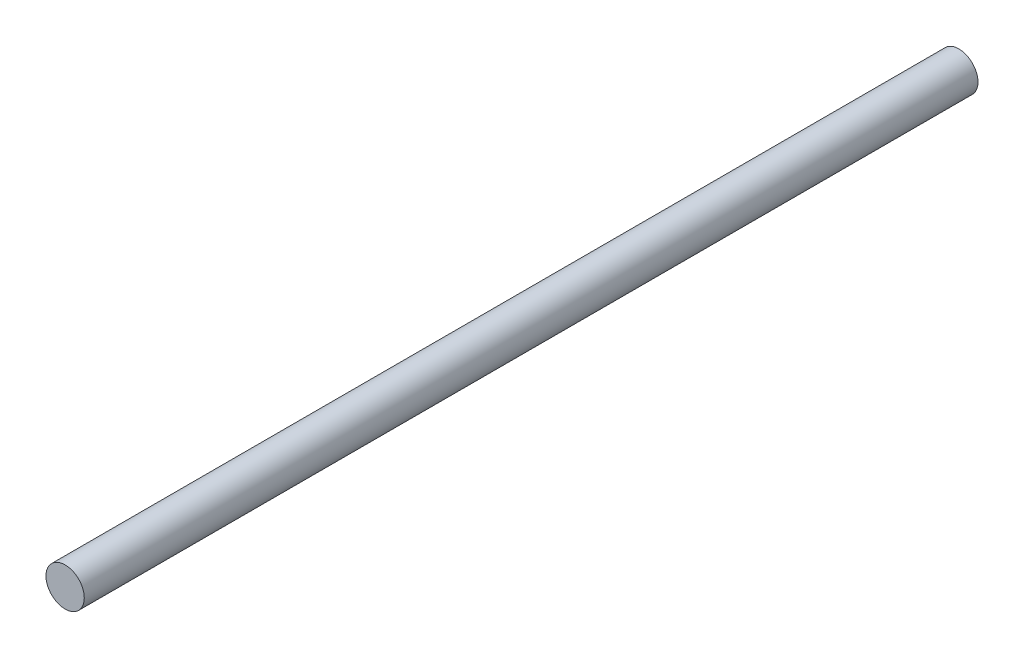
ISO-10303-21;
HEADER;
FILE_DESCRIPTION(('STEP AP214'),'2;1');
FILE_NAME('part.step','',(''),(''),'','','');
FILE_SCHEMA(('AUTOMOTIVE_DESIGN { 1 0 10303 214 1 1 1 1 }'));
ENDSEC;
DATA;
#1=APPLICATION_CONTEXT('core data for automotive mechanical design processes');
#2=APPLICATION_PROTOCOL_DEFINITION('international standard','automotive_design',2000,#1);
#3=PRODUCT_CONTEXT('',#1,'mechanical');
#4=PRODUCT('Part','Part','',(#3));
#5=PRODUCT_RELATED_PRODUCT_CATEGORY('part','',(#4));
#6=PRODUCT_DEFINITION_FORMATION('','',#4);
#7=PRODUCT_DEFINITION_CONTEXT('part definition',#1,'design');
#8=PRODUCT_DEFINITION('design','',#6,#7);
#9=PRODUCT_DEFINITION_SHAPE('','',#8);
#10=(LENGTH_UNIT() NAMED_UNIT(*) SI_UNIT(.MILLI.,.METRE.));
#11=(NAMED_UNIT(*) PLANE_ANGLE_UNIT() SI_UNIT($,.RADIAN.));
#12=(NAMED_UNIT(*) SI_UNIT($,.STERADIAN.) SOLID_ANGLE_UNIT());
#13=UNCERTAINTY_MEASURE_WITH_UNIT(LENGTH_MEASURE(1.E-05),#10,'distance_accuracy_value','');
#14=(GEOMETRIC_REPRESENTATION_CONTEXT(3) GLOBAL_UNCERTAINTY_ASSIGNED_CONTEXT((#13)) GLOBAL_UNIT_ASSIGNED_CONTEXT((#10,
#11,#12)) REPRESENTATION_CONTEXT('',''));
#15=CARTESIAN_POINT('',(0.,0.,0.));
#16=DIRECTION('',(0.,0.,1.));
#17=DIRECTION('',(1.,0.,0.));
#18=AXIS2_PLACEMENT_3D('',#15,#16,#17);
#19=CARTESIAN_POINT('',(0.,0.,177.8));
#20=DIRECTION('',(0.,0.,-1.));
#21=DIRECTION('',(-1.,0.,0.));
#22=AXIS2_PLACEMENT_3D('',#19,#20,#21);
#23=CYLINDRICAL_SURFACE('',#22,3.81);
#24=CARTESIAN_POINT('',(0.,0.,177.8));
#25=DIRECTION('',(0.,0.,1.));
#26=DIRECTION('',(1.,0.,0.));
#27=AXIS2_PLACEMENT_3D('',#24,#25,#26);
#28=CIRCLE('',#27,3.81);
#29=CARTESIAN_POINT('',(3.81,0.,177.8));
#30=VERTEX_POINT('',#29);
#31=EDGE_CURVE('E10',#30,#30,#28,.T.);
#32=ORIENTED_EDGE('',*,*,#31,.F.);
#33=EDGE_LOOP('',(#32));
#34=FACE_BOUND('',#33,.T.);
#35=CARTESIAN_POINT('',(0.,0.,0.));
#36=DIRECTION('',(0.,0.,1.));
#37=DIRECTION('',(1.,0.,0.));
#38=AXIS2_PLACEMENT_3D('',#35,#36,#37);
#39=CIRCLE('',#38,3.81);
#40=CARTESIAN_POINT('',(3.81,0.,0.));
#41=VERTEX_POINT('',#40);
#42=EDGE_CURVE('E35',#41,#41,#39,.T.);
#43=ORIENTED_EDGE('',*,*,#42,.T.);
#44=EDGE_LOOP('',(#43));
#45=FACE_BOUND('',#44,.T.);
#46=ADVANCED_FACE('F32',(#34,#45),#23,.T.);
#47=CARTESIAN_POINT('',(0.,0.,177.8));
#48=DIRECTION('',(0.,0.,1.));
#49=DIRECTION('',(1.,0.,0.));
#50=AXIS2_PLACEMENT_3D('',#47,#48,#49);
#51=PLANE('',#50);
#52=ORIENTED_EDGE('',*,*,#31,.T.);
#53=EDGE_LOOP('',(#52));
#54=FACE_BOUND('',#53,.T.);
#55=ADVANCED_FACE('F47',(#54),#51,.T.);
#56=CARTESIAN_POINT('',(0.,0.,0.));
#57=DIRECTION('',(0.,0.,1.));
#58=DIRECTION('',(1.,0.,0.));
#59=AXIS2_PLACEMENT_3D('',#56,#57,#58);
#60=PLANE('',#59);
#61=ORIENTED_EDGE('',*,*,#42,.F.);
#62=EDGE_LOOP('',(#61));
#63=FACE_BOUND('',#62,.T.);
#64=ADVANCED_FACE('F45',(#63),#60,.F.);
#65=CLOSED_SHELL('',(#46,#55,#64));
#66=MANIFOLD_SOLID_BREP('B2',#65);
#67=ADVANCED_BREP_SHAPE_REPRESENTATION('',(#18,#66),#14);
#68=SHAPE_DEFINITION_REPRESENTATION(#9,#67);
ENDSEC;
END-ISO-10303-21;
